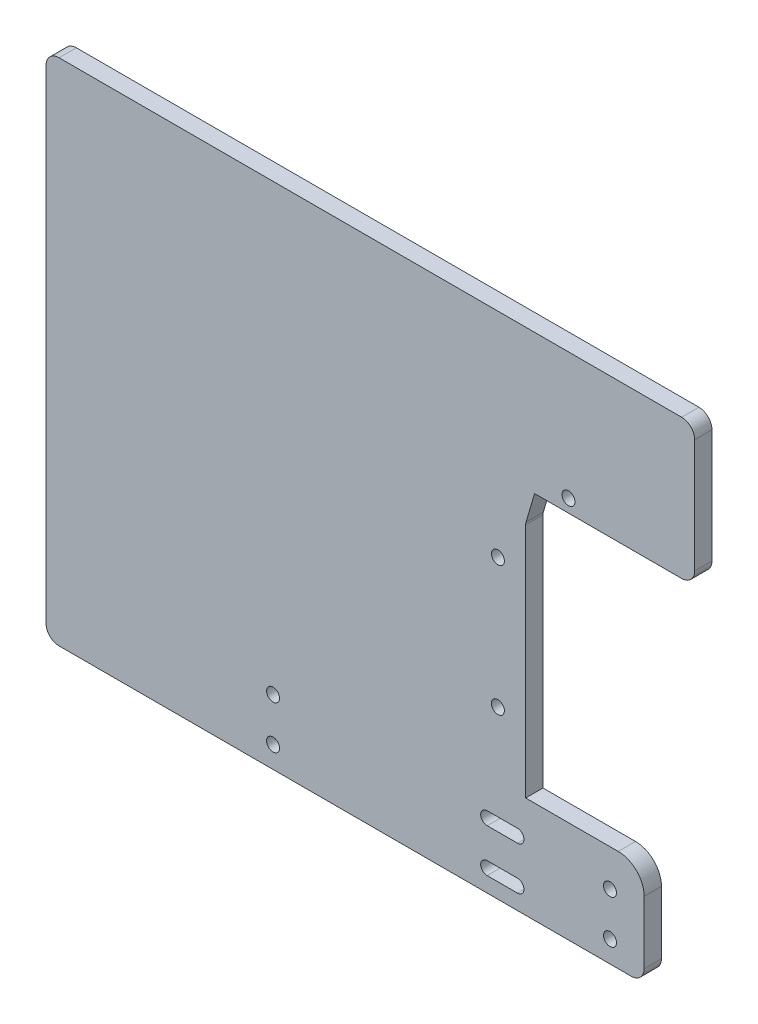
ISO-10303-21;
HEADER;
FILE_DESCRIPTION(('STEP AP214'),'2;1');
FILE_NAME('part.step','',(''),(''),'','','');
FILE_SCHEMA(('AUTOMOTIVE_DESIGN { 1 0 10303 214 1 1 1 1 }'));
ENDSEC;
DATA;
#1=APPLICATION_CONTEXT('core data for automotive mechanical design processes');
#2=APPLICATION_PROTOCOL_DEFINITION('international standard','automotive_design',2000,#1);
#3=PRODUCT_CONTEXT('',#1,'mechanical');
#4=PRODUCT('Part','Part','',(#3));
#5=PRODUCT_RELATED_PRODUCT_CATEGORY('part','',(#4));
#6=PRODUCT_DEFINITION_FORMATION('','',#4);
#7=PRODUCT_DEFINITION_CONTEXT('part definition',#1,'design');
#8=PRODUCT_DEFINITION('design','',#6,#7);
#9=PRODUCT_DEFINITION_SHAPE('','',#8);
#10=(LENGTH_UNIT() NAMED_UNIT(*) SI_UNIT(.MILLI.,.METRE.));
#11=(NAMED_UNIT(*) PLANE_ANGLE_UNIT() SI_UNIT($,.RADIAN.));
#12=(NAMED_UNIT(*) SI_UNIT($,.STERADIAN.) SOLID_ANGLE_UNIT());
#13=UNCERTAINTY_MEASURE_WITH_UNIT(LENGTH_MEASURE(1.E-05),#10,'distance_accuracy_value','');
#14=(GEOMETRIC_REPRESENTATION_CONTEXT(3) GLOBAL_UNCERTAINTY_ASSIGNED_CONTEXT((#13)) GLOBAL_UNIT_ASSIGNED_CONTEXT((#10,
#11,#12)) REPRESENTATION_CONTEXT('',''));
#15=CARTESIAN_POINT('',(0.,0.,0.));
#16=DIRECTION('',(0.,0.,1.));
#17=DIRECTION('',(1.,0.,0.));
#18=AXIS2_PLACEMENT_3D('',#15,#16,#17);
#19=CARTESIAN_POINT('',(25.6446855033038,139.732138716029,4.));
#20=DIRECTION('',(0.,0.,-1.));
#21=DIRECTION('',(-1.,0.,0.));
#22=AXIS2_PLACEMENT_3D('',#19,#20,#21);
#23=CYLINDRICAL_SURFACE('',#22,1.5);
#24=CARTESIAN_POINT('',(25.6446855033038,139.732138716029,0.));
#25=DIRECTION('',(0.,0.,1.));
#26=DIRECTION('',(1.,0.,0.));
#27=AXIS2_PLACEMENT_3D('',#24,#25,#26);
#28=CIRCLE('',#27,1.5);
#29=CARTESIAN_POINT('',(25.6446855033038,138.232138716029,0.));
#30=VERTEX_POINT('',#29);
#31=CARTESIAN_POINT('',(25.6446855033037,141.232138716029,0.));
#32=VERTEX_POINT('',#31);
#33=EDGE_CURVE('E408',#30,#32,#28,.T.);
#34=ORIENTED_EDGE('',*,*,#33,.F.);
#35=DIRECTION('',(0.,0.,-1.));
#36=VECTOR('',#35,1.);
#37=CARTESIAN_POINT('',(25.6446855033038,138.232138716029,4.));
#38=LINE('',#37,#36);
#39=CARTESIAN_POINT('',(25.6446855033038,138.232138716029,4.));
#40=VERTEX_POINT('',#39);
#41=EDGE_CURVE('E442',#40,#30,#38,.T.);
#42=ORIENTED_EDGE('',*,*,#41,.F.);
#43=CARTESIAN_POINT('',(25.6446855033038,139.732138716029,4.));
#44=DIRECTION('',(0.,0.,1.));
#45=DIRECTION('',(1.,0.,0.));
#46=AXIS2_PLACEMENT_3D('',#43,#44,#45);
#47=CIRCLE('',#46,1.5);
#48=CARTESIAN_POINT('',(25.6446855033037,141.232138716029,4.));
#49=VERTEX_POINT('',#48);
#50=EDGE_CURVE('E307',#40,#49,#47,.T.);
#51=ORIENTED_EDGE('',*,*,#50,.T.);
#52=DIRECTION('',(0.,0.,-1.));
#53=VECTOR('',#52,1.);
#54=CARTESIAN_POINT('',(25.6446855033037,141.232138716029,4.));
#55=LINE('',#54,#53);
#56=EDGE_CURVE('E432',#49,#32,#55,.T.);
#57=ORIENTED_EDGE('',*,*,#56,.T.);
#58=EDGE_LOOP('',(#34,#42,#51,#57));
#59=FACE_BOUND('',#58,.T.);
#60=ADVANCED_FACE('F47',(#59),#23,.F.);
#61=CARTESIAN_POINT('',(-5.48101796948979E-13,138.232138716029,4.));
#62=DIRECTION('',(0.,1.,0.));
#63=DIRECTION('',(-1.,0.,0.));
#64=AXIS2_PLACEMENT_3D('',#61,#62,#63);
#65=PLANE('',#64);
#66=DIRECTION('',(1.,0.,0.));
#67=VECTOR('',#66,1.);
#68=CARTESIAN_POINT('',(-5.48101796948979E-13,138.232138716029,0.));
#69=LINE('',#68,#67);
#70=CARTESIAN_POINT('',(18.6446855033037,138.232138716029,0.));
#71=VERTEX_POINT('',#70);
#72=EDGE_CURVE('E412',#71,#30,#69,.T.);
#73=ORIENTED_EDGE('',*,*,#72,.F.);
#74=DIRECTION('',(0.,0.,-1.));
#75=VECTOR('',#74,1.);
#76=CARTESIAN_POINT('',(18.6446855033037,138.232138716029,4.));
#77=LINE('',#76,#75);
#78=CARTESIAN_POINT('',(18.6446855033037,138.232138716029,4.));
#79=VERTEX_POINT('',#78);
#80=EDGE_CURVE('E439',#79,#71,#77,.T.);
#81=ORIENTED_EDGE('',*,*,#80,.F.);
#82=DIRECTION('',(1.,0.,0.));
#83=VECTOR('',#82,1.);
#84=CARTESIAN_POINT('',(-5.48101796948979E-13,138.232138716029,4.));
#85=LINE('',#84,#83);
#86=EDGE_CURVE('E311',#79,#40,#85,.T.);
#87=ORIENTED_EDGE('',*,*,#86,.T.);
#88=ORIENTED_EDGE('',*,*,#41,.T.);
#89=EDGE_LOOP('',(#73,#81,#87,#88));
#90=FACE_BOUND('',#89,.T.);
#91=ADVANCED_FACE('F584',(#90),#65,.T.);
#92=CARTESIAN_POINT('',(18.6446855033037,139.732138716029,4.));
#93=DIRECTION('',(0.,0.,-1.));
#94=DIRECTION('',(-1.,0.,0.));
#95=AXIS2_PLACEMENT_3D('',#92,#93,#94);
#96=CYLINDRICAL_SURFACE('',#95,1.50000000000002);
#97=CARTESIAN_POINT('',(18.6446855033037,139.732138716029,0.));
#98=DIRECTION('',(0.,0.,1.));
#99=DIRECTION('',(1.,0.,0.));
#100=AXIS2_PLACEMENT_3D('',#97,#98,#99);
#101=CIRCLE('',#100,1.50000000000002);
#102=CARTESIAN_POINT('',(18.6446855033037,141.232138716029,0.));
#103=VERTEX_POINT('',#102);
#104=EDGE_CURVE('E416',#103,#71,#101,.T.);
#105=ORIENTED_EDGE('',*,*,#104,.F.);
#106=DIRECTION('',(0.,0.,-1.));
#107=VECTOR('',#106,1.);
#108=CARTESIAN_POINT('',(18.6446855033037,141.232138716029,4.));
#109=LINE('',#108,#107);
#110=CARTESIAN_POINT('',(18.6446855033037,141.232138716029,4.));
#111=VERTEX_POINT('',#110);
#112=EDGE_CURVE('E435',#111,#103,#109,.T.);
#113=ORIENTED_EDGE('',*,*,#112,.F.);
#114=CARTESIAN_POINT('',(18.6446855033037,139.732138716029,4.));
#115=DIRECTION('',(0.,0.,1.));
#116=DIRECTION('',(1.,0.,0.));
#117=AXIS2_PLACEMENT_3D('',#114,#115,#116);
#118=CIRCLE('',#117,1.50000000000002);
#119=EDGE_CURVE('E315',#111,#79,#118,.T.);
#120=ORIENTED_EDGE('',*,*,#119,.T.);
#121=ORIENTED_EDGE('',*,*,#80,.T.);
#122=EDGE_LOOP('',(#105,#113,#120,#121));
#123=FACE_BOUND('',#122,.T.);
#124=ADVANCED_FACE('F590',(#123),#96,.F.);
#125=CARTESIAN_POINT('',(18.6446855033037,149.732138716029,4.));
#126=DIRECTION('',(0.,0.,-1.));
#127=DIRECTION('',(-1.,0.,0.));
#128=AXIS2_PLACEMENT_3D('',#125,#126,#127);
#129=CYLINDRICAL_SURFACE('',#128,1.5);
#130=CARTESIAN_POINT('',(18.6446855033037,149.732138716029,0.));
#131=DIRECTION('',(0.,0.,1.));
#132=DIRECTION('',(1.,0.,0.));
#133=AXIS2_PLACEMENT_3D('',#130,#131,#132);
#134=CIRCLE('',#133,1.5);
#135=CARTESIAN_POINT('',(18.6446855033037,151.232138716029,0.));
#136=VERTEX_POINT('',#135);
#137=CARTESIAN_POINT('',(18.6446855033037,148.232138716029,0.));
#138=VERTEX_POINT('',#137);
#139=EDGE_CURVE('E392',#136,#138,#134,.T.);
#140=ORIENTED_EDGE('',*,*,#139,.F.);
#141=DIRECTION('',(0.,0.,-1.));
#142=VECTOR('',#141,1.);
#143=CARTESIAN_POINT('',(18.6446855033037,151.232138716029,4.));
#144=LINE('',#143,#142);
#145=CARTESIAN_POINT('',(18.6446855033037,151.232138716029,4.));
#146=VERTEX_POINT('',#145);
#147=EDGE_CURVE('E436',#146,#136,#144,.T.);
#148=ORIENTED_EDGE('',*,*,#147,.F.);
#149=CARTESIAN_POINT('',(18.6446855033037,149.732138716029,4.));
#150=DIRECTION('',(0.,0.,1.));
#151=DIRECTION('',(1.,0.,0.));
#152=AXIS2_PLACEMENT_3D('',#149,#150,#151);
#153=CIRCLE('',#152,1.5);
#154=CARTESIAN_POINT('',(18.6446855033037,148.232138716029,4.));
#155=VERTEX_POINT('',#154);
#156=EDGE_CURVE('E291',#146,#155,#153,.T.);
#157=ORIENTED_EDGE('',*,*,#156,.T.);
#158=DIRECTION('',(0.,0.,-1.));
#159=VECTOR('',#158,1.);
#160=CARTESIAN_POINT('',(18.6446855033037,148.232138716029,4.));
#161=LINE('',#160,#159);
#162=EDGE_CURVE('E232',#155,#138,#161,.T.);
#163=ORIENTED_EDGE('',*,*,#162,.T.);
#164=EDGE_LOOP('',(#140,#148,#157,#163));
#165=FACE_BOUND('',#164,.T.);
#166=ADVANCED_FACE('F609',(#165),#129,.F.);
#167=CARTESIAN_POINT('',(0.,151.232138716029,4.));
#168=DIRECTION('',(0.,-1.,0.));
#169=DIRECTION('',(0.,0.,-1.));
#170=AXIS2_PLACEMENT_3D('',#167,#168,#169);
#171=PLANE('',#170);
#172=DIRECTION('',(-1.,0.,0.));
#173=VECTOR('',#172,1.);
#174=CARTESIAN_POINT('',(0.,151.232138716029,0.));
#175=LINE('',#174,#173);
#176=CARTESIAN_POINT('',(25.6446855033037,151.232138716029,0.));
#177=VERTEX_POINT('',#176);
#178=EDGE_CURVE('E396',#177,#136,#175,.T.);
#179=ORIENTED_EDGE('',*,*,#178,.F.);
#180=DIRECTION('',(0.,0.,-1.));
#181=VECTOR('',#180,1.);
#182=CARTESIAN_POINT('',(25.6446855033037,151.232138716029,4.));
#183=LINE('',#182,#181);
#184=CARTESIAN_POINT('',(25.6446855033037,151.232138716029,4.));
#185=VERTEX_POINT('',#184);
#186=EDGE_CURVE('E451',#185,#177,#183,.T.);
#187=ORIENTED_EDGE('',*,*,#186,.F.);
#188=DIRECTION('',(-1.,0.,0.));
#189=VECTOR('',#188,1.);
#190=CARTESIAN_POINT('',(0.,151.232138716029,4.));
#191=LINE('',#190,#189);
#192=EDGE_CURVE('E295',#185,#146,#191,.T.);
#193=ORIENTED_EDGE('',*,*,#192,.T.);
#194=ORIENTED_EDGE('',*,*,#147,.T.);
#195=EDGE_LOOP('',(#179,#187,#193,#194));
#196=FACE_BOUND('',#195,.T.);
#197=ADVANCED_FACE('F605',(#196),#171,.T.);
#198=CARTESIAN_POINT('',(25.6446855033037,149.732138716029,4.));
#199=DIRECTION('',(0.,0.,-1.));
#200=DIRECTION('',(-1.,0.,0.));
#201=AXIS2_PLACEMENT_3D('',#198,#199,#200);
#202=CYLINDRICAL_SURFACE('',#201,1.5);
#203=CARTESIAN_POINT('',(25.6446855033037,149.732138716029,0.));
#204=DIRECTION('',(0.,0.,1.));
#205=DIRECTION('',(1.,0.,0.));
#206=AXIS2_PLACEMENT_3D('',#203,#204,#205);
#207=CIRCLE('',#206,1.5);
#208=CARTESIAN_POINT('',(25.6446855033037,148.232138716029,0.));
#209=VERTEX_POINT('',#208);
#210=EDGE_CURVE('E400',#209,#177,#207,.T.);
#211=ORIENTED_EDGE('',*,*,#210,.F.);
#212=DIRECTION('',(0.,0.,-1.));
#213=VECTOR('',#212,1.);
#214=CARTESIAN_POINT('',(25.6446855033037,148.232138716029,4.));
#215=LINE('',#214,#213);
#216=CARTESIAN_POINT('',(25.6446855033037,148.232138716029,4.));
#217=VERTEX_POINT('',#216);
#218=EDGE_CURVE('E448',#217,#209,#215,.T.);
#219=ORIENTED_EDGE('',*,*,#218,.F.);
#220=CARTESIAN_POINT('',(25.6446855033037,149.732138716029,4.));
#221=DIRECTION('',(0.,0.,1.));
#222=DIRECTION('',(1.,0.,0.));
#223=AXIS2_PLACEMENT_3D('',#220,#221,#222);
#224=CIRCLE('',#223,1.5);
#225=EDGE_CURVE('E299',#217,#185,#224,.T.);
#226=ORIENTED_EDGE('',*,*,#225,.T.);
#227=ORIENTED_EDGE('',*,*,#186,.T.);
#228=EDGE_LOOP('',(#211,#219,#226,#227));
#229=FACE_BOUND('',#228,.T.);
#230=ADVANCED_FACE('F602',(#229),#202,.F.);
#231=CARTESIAN_POINT('',(0.,134.732138716025,4.));
#232=DIRECTION('',(0.,1.,0.));
#233=DIRECTION('',(-1.,0.,0.));
#234=AXIS2_PLACEMENT_3D('',#231,#232,#233);
#235=PLANE('',#234);
#236=DIRECTION('',(1.,0.,0.));
#237=VECTOR('',#236,1.);
#238=CARTESIAN_POINT('',(0.,134.732138716025,0.));
#239=LINE('',#238,#237);
#240=CARTESIAN_POINT('',(-80.3753144967017,134.732138716025,0.));
#241=VERTEX_POINT('',#240);
#242=CARTESIAN_POINT('',(51.9446855033038,134.732138716025,0.));
#243=VERTEX_POINT('',#242);
#244=EDGE_CURVE('E332',#241,#243,#239,.T.);
#245=ORIENTED_EDGE('',*,*,#244,.T.);
#246=DIRECTION('',(0.,0.,-1.));
#247=VECTOR('',#246,1.);
#248=CARTESIAN_POINT('',(51.9446855033038,134.732138716025,4.));
#249=LINE('',#248,#247);
#250=CARTESIAN_POINT('',(51.9446855033038,134.732138716025,4.));
#251=VERTEX_POINT('',#250);
#252=EDGE_CURVE('E520',#243,#251,#249,.F.);
#253=ORIENTED_EDGE('',*,*,#252,.T.);
#254=DIRECTION('',(1.,0.,0.));
#255=VECTOR('',#254,1.);
#256=CARTESIAN_POINT('',(0.,134.732138716025,4.));
#257=LINE('',#256,#255);
#258=CARTESIAN_POINT('',(-80.3753144967017,134.732138716025,4.));
#259=VERTEX_POINT('',#258);
#260=EDGE_CURVE('E222',#259,#251,#257,.T.);
#261=ORIENTED_EDGE('',*,*,#260,.F.);
#262=DIRECTION('',(0.,0.,-1.));
#263=VECTOR('',#262,1.);
#264=CARTESIAN_POINT('',(-80.3753144967017,134.732138716025,4.));
#265=LINE('',#264,#263);
#266=EDGE_CURVE('E516',#259,#241,#265,.T.);
#267=ORIENTED_EDGE('',*,*,#266,.T.);
#268=EDGE_LOOP('',(#245,#253,#261,#267));
#269=FACE_BOUND('',#268,.T.);
#270=ADVANCED_FACE('F539',(#269),#235,.F.);
#271=CARTESIAN_POINT('',(54.9446855033038,0.,4.));
#272=DIRECTION('',(-1.,0.,0.));
#273=DIRECTION('',(0.,0.,1.));
#274=AXIS2_PLACEMENT_3D('',#271,#272,#273);
#275=PLANE('',#274);
#276=DIRECTION('',(0.,1.,0.));
#277=VECTOR('',#276,1.);
#278=CARTESIAN_POINT('',(54.9446855033038,0.,4.));
#279=LINE('',#278,#277);
#280=CARTESIAN_POINT('',(54.9446855033038,137.732138716025,4.));
#281=VERTEX_POINT('',#280);
#282=CARTESIAN_POINT('',(54.9446855033038,152.232138716029,4.));
#283=VERTEX_POINT('',#282);
#284=EDGE_CURVE('E207',#281,#283,#279,.T.);
#285=ORIENTED_EDGE('',*,*,#284,.F.);
#286=DIRECTION('',(0.,0.,-1.));
#287=VECTOR('',#286,1.);
#288=CARTESIAN_POINT('',(54.9446855033038,137.732138716025,4.));
#289=LINE('',#288,#287);
#290=CARTESIAN_POINT('',(54.9446855033038,137.732138716025,0.));
#291=VERTEX_POINT('',#290);
#292=EDGE_CURVE('E513',#281,#291,#289,.T.);
#293=ORIENTED_EDGE('',*,*,#292,.T.);
#294=DIRECTION('',(0.,1.,0.));
#295=VECTOR('',#294,1.);
#296=CARTESIAN_POINT('',(54.9446855033038,0.,0.));
#297=LINE('',#296,#295);
#298=CARTESIAN_POINT('',(54.9446855033038,152.232138716029,0.));
#299=VERTEX_POINT('',#298);
#300=EDGE_CURVE('E228',#291,#299,#297,.T.);
#301=ORIENTED_EDGE('',*,*,#300,.T.);
#302=DIRECTION('',(0.,0.,-1.));
#303=VECTOR('',#302,1.);
#304=CARTESIAN_POINT('',(54.9446855033038,152.232138716029,4.));
#305=LINE('',#304,#303);
#306=EDGE_CURVE('E225',#283,#299,#305,.T.);
#307=ORIENTED_EDGE('',*,*,#306,.F.);
#308=EDGE_LOOP('',(#285,#293,#301,#307));
#309=FACE_BOUND('',#308,.T.);
#310=ADVANCED_FACE('F226',(#309),#275,.F.);
#311=CARTESIAN_POINT('',(48.9446855033037,152.232138716029,4.));
#312=DIRECTION('',(0.,0.,-1.));
#313=DIRECTION('',(-1.,0.,0.));
#314=AXIS2_PLACEMENT_3D('',#311,#312,#313);
#315=CYLINDRICAL_SURFACE('',#314,6.00000000000001);
#316=CARTESIAN_POINT('',(48.9446855033037,152.232138716029,0.));
#317=DIRECTION('',(0.,0.,1.));
#318=DIRECTION('',(1.,0.,0.));
#319=AXIS2_PLACEMENT_3D('',#316,#317,#318);
#320=CIRCLE('',#319,6.00000000000001);
#321=CARTESIAN_POINT('',(48.9446855033037,158.232138716029,0.));
#322=VERTEX_POINT('',#321);
#323=EDGE_CURVE('E338',#299,#322,#320,.T.);
#324=ORIENTED_EDGE('',*,*,#323,.T.);
#325=DIRECTION('',(0.,0.,-1.));
#326=VECTOR('',#325,1.);
#327=CARTESIAN_POINT('',(48.9446855033037,158.232138716029,4.));
#328=LINE('',#327,#326);
#329=CARTESIAN_POINT('',(48.9446855033037,158.232138716029,4.));
#330=VERTEX_POINT('',#329);
#331=EDGE_CURVE('E233',#330,#322,#328,.T.);
#332=ORIENTED_EDGE('',*,*,#331,.F.);
#333=CARTESIAN_POINT('',(48.9446855033037,152.232138716029,4.));
#334=DIRECTION('',(0.,0.,1.));
#335=DIRECTION('',(1.,0.,0.));
#336=AXIS2_PLACEMENT_3D('',#333,#334,#335);
#337=CIRCLE('',#336,6.00000000000001);
#338=EDGE_CURVE('E213',#283,#330,#337,.T.);
#339=ORIENTED_EDGE('',*,*,#338,.F.);
#340=ORIENTED_EDGE('',*,*,#306,.T.);
#341=EDGE_LOOP('',(#324,#332,#339,#340));
#342=FACE_BOUND('',#341,.T.);
#343=ADVANCED_FACE('F235',(#342),#315,.T.);
#344=CARTESIAN_POINT('',(0.,158.232138716029,4.));
#345=DIRECTION('',(0.,-1.,0.));
#346=DIRECTION('',(0.,0.,-1.));
#347=AXIS2_PLACEMENT_3D('',#344,#345,#346);
#348=PLANE('',#347);
#349=DIRECTION('',(-1.,0.,0.));
#350=VECTOR('',#349,1.);
#351=CARTESIAN_POINT('',(0.,158.232138716029,0.));
#352=LINE('',#351,#350);
#353=CARTESIAN_POINT('',(27.5446855033038,158.232138716029,0.));
#354=VERTEX_POINT('',#353);
#355=EDGE_CURVE('E341',#322,#354,#352,.T.);
#356=ORIENTED_EDGE('',*,*,#355,.T.);
#357=DIRECTION('',(0.,0.,-1.));
#358=VECTOR('',#357,1.);
#359=CARTESIAN_POINT('',(27.5446855033038,158.232138716029,4.));
#360=LINE('',#359,#358);
#361=CARTESIAN_POINT('',(27.5446855033038,158.232138716029,4.));
#362=VERTEX_POINT('',#361);
#363=EDGE_CURVE('E464',#362,#354,#360,.T.);
#364=ORIENTED_EDGE('',*,*,#363,.F.);
#365=DIRECTION('',(-1.,0.,0.));
#366=VECTOR('',#365,1.);
#367=CARTESIAN_POINT('',(0.,158.232138716029,4.));
#368=LINE('',#367,#366);
#369=EDGE_CURVE('E239',#330,#362,#368,.T.);
#370=ORIENTED_EDGE('',*,*,#369,.F.);
#371=ORIENTED_EDGE('',*,*,#331,.T.);
#372=EDGE_LOOP('',(#356,#364,#370,#371));
#373=FACE_BOUND('',#372,.T.);
#374=ADVANCED_FACE('F546',(#373),#348,.F.);
#375=CARTESIAN_POINT('',(27.5446855033039,0.,4.));
#376=DIRECTION('',(1.,0.,0.));
#377=DIRECTION('',(0.,1.,0.));
#378=AXIS2_PLACEMENT_3D('',#375,#376,#377);
#379=PLANE('',#378);
#380=DIRECTION('',(0.,-1.,0.));
#381=VECTOR('',#380,1.);
#382=CARTESIAN_POINT('',(27.5446855033039,0.,0.));
#383=LINE('',#382,#381);
#384=CARTESIAN_POINT('',(27.5446855033038,212.944120657372,0.));
#385=VERTEX_POINT('',#384);
#386=EDGE_CURVE('E345',#385,#354,#383,.T.);
#387=ORIENTED_EDGE('',*,*,#386,.F.);
#388=DIRECTION('',(0.,0.,-1.));
#389=VECTOR('',#388,1.);
#390=CARTESIAN_POINT('',(27.5446855033038,212.944120657372,4.));
#391=LINE('',#390,#389);
#392=CARTESIAN_POINT('',(27.5446855033038,212.944120657372,4.));
#393=VERTEX_POINT('',#392);
#394=EDGE_CURVE('E461',#393,#385,#391,.T.);
#395=ORIENTED_EDGE('',*,*,#394,.F.);
#396=DIRECTION('',(0.,-1.,0.));
#397=VECTOR('',#396,1.);
#398=CARTESIAN_POINT('',(27.5446855033039,0.,4.));
#399=LINE('',#398,#397);
#400=EDGE_CURVE('E242',#393,#362,#399,.T.);
#401=ORIENTED_EDGE('',*,*,#400,.T.);
#402=ORIENTED_EDGE('',*,*,#363,.T.);
#403=EDGE_LOOP('',(#387,#395,#401,#402));
#404=FACE_BOUND('',#403,.T.);
#405=ADVANCED_FACE('F648',(#404),#379,.T.);
#406=CARTESIAN_POINT('',(29.5446855033069,212.944120657372,4.));
#407=DIRECTION('',(0.,0.,-1.));
#408=DIRECTION('',(-1.,0.,0.));
#409=AXIS2_PLACEMENT_3D('',#406,#407,#408);
#410=CYLINDRICAL_SURFACE('',#409,2.00000000000303);
#411=CARTESIAN_POINT('',(29.5446855033069,212.944120657372,0.));
#412=DIRECTION('',(0.,0.,1.));
#413=DIRECTION('',(1.,0.,0.));
#414=AXIS2_PLACEMENT_3D('',#411,#412,#413);
#415=CIRCLE('',#414,2.00000000000303);
#416=CARTESIAN_POINT('',(27.6259545001614,213.508453305355,0.));
#417=VERTEX_POINT('',#416);
#418=EDGE_CURVE('E349',#417,#385,#415,.T.);
#419=ORIENTED_EDGE('',*,*,#418,.F.);
#420=DIRECTION('',(0.,0.,-1.));
#421=VECTOR('',#420,1.);
#422=CARTESIAN_POINT('',(27.6259545001614,213.508453305355,4.));
#423=LINE('',#422,#421);
#424=CARTESIAN_POINT('',(27.6259545001614,213.508453305355,4.));
#425=VERTEX_POINT('',#424);
#426=EDGE_CURVE('E458',#425,#417,#423,.T.);
#427=ORIENTED_EDGE('',*,*,#426,.F.);
#428=CARTESIAN_POINT('',(29.5446855033069,212.944120657372,4.));
#429=DIRECTION('',(0.,0.,1.));
#430=DIRECTION('',(1.,0.,0.));
#431=AXIS2_PLACEMENT_3D('',#428,#429,#430);
#432=CIRCLE('',#431,2.00000000000303);
#433=EDGE_CURVE('E249',#425,#393,#432,.T.);
#434=ORIENTED_EDGE('',*,*,#433,.T.);
#435=ORIENTED_EDGE('',*,*,#394,.T.);
#436=EDGE_LOOP('',(#419,#427,#434,#435));
#437=FACE_BOUND('',#436,.T.);
#438=ADVANCED_FACE('F554',(#437),#410,.F.);
#439=CARTESIAN_POINT('',(-32.3704384726988,9.52071719786343,4.));
#440=DIRECTION('',(0.959365501571184,-0.282166323991846,0.));
#441=DIRECTION('',(0.282166323991846,0.959365501571184,0.));
#442=AXIS2_PLACEMENT_3D('',#439,#440,#441);
#443=PLANE('',#442);
#444=DIRECTION('',(-0.282166323991846,-0.959365501571183,0.));
#445=VECTOR('',#444,1.);
#446=CARTESIAN_POINT('',(-32.3704384726988,9.52071719786343,0.));
#447=LINE('',#446,#445);
#448=CARTESIAN_POINT('',(29.6035090327146,220.232138716029,0.));
#449=VERTEX_POINT('',#448);
#450=EDGE_CURVE('E353',#449,#417,#447,.T.);
#451=ORIENTED_EDGE('',*,*,#450,.F.);
#452=DIRECTION('',(0.,0.,-1.));
#453=VECTOR('',#452,1.);
#454=CARTESIAN_POINT('',(29.6035090327146,220.232138716029,4.));
#455=LINE('',#454,#453);
#456=CARTESIAN_POINT('',(29.6035090327146,220.232138716029,4.));
#457=VERTEX_POINT('',#456);
#458=EDGE_CURVE('E331',#457,#449,#455,.T.);
#459=ORIENTED_EDGE('',*,*,#458,.F.);
#460=DIRECTION('',(-0.282166323991846,-0.959365501571183,0.));
#461=VECTOR('',#460,1.);
#462=CARTESIAN_POINT('',(-32.3704384726988,9.52071719786343,4.));
#463=LINE('',#462,#461);
#464=EDGE_CURVE('E253',#457,#425,#463,.T.);
#465=ORIENTED_EDGE('',*,*,#464,.T.);
#466=ORIENTED_EDGE('',*,*,#426,.T.);
#467=EDGE_LOOP('',(#451,#459,#465,#466));
#468=FACE_BOUND('',#467,.T.);
#469=ADVANCED_FACE('F558',(#468),#443,.T.);
#470=CARTESIAN_POINT('',(0.,220.232138716029,4.));
#471=DIRECTION('',(0.,1.,0.));
#472=DIRECTION('',(0.,0.,1.));
#473=AXIS2_PLACEMENT_3D('',#470,#471,#472);
#474=PLANE('',#473);
#475=DIRECTION('',(1.,0.,0.));
#476=VECTOR('',#475,1.);
#477=CARTESIAN_POINT('',(0.,220.232138716029,0.));
#478=LINE('',#477,#476);
#479=CARTESIAN_POINT('',(63.6246855032982,220.232138716029,0.));
#480=VERTEX_POINT('',#479);
#481=EDGE_CURVE('E357',#449,#480,#478,.T.);
#482=ORIENTED_EDGE('',*,*,#481,.T.);
#483=DIRECTION('',(0.,0.,-1.));
#484=VECTOR('',#483,1.);
#485=CARTESIAN_POINT('',(63.6246855032982,220.232138716029,4.));
#486=LINE('',#485,#484);
#487=CARTESIAN_POINT('',(63.6246855032982,220.232138716029,4.));
#488=VERTEX_POINT('',#487);
#489=EDGE_CURVE('E510',#480,#488,#486,.F.);
#490=ORIENTED_EDGE('',*,*,#489,.T.);
#491=DIRECTION('',(1.,0.,0.));
#492=VECTOR('',#491,1.);
#493=CARTESIAN_POINT('',(0.,220.232138716029,4.));
#494=LINE('',#493,#492);
#495=EDGE_CURVE('E257',#457,#488,#494,.T.);
#496=ORIENTED_EDGE('',*,*,#495,.F.);
#497=ORIENTED_EDGE('',*,*,#458,.T.);
#498=EDGE_LOOP('',(#482,#490,#496,#497));
#499=FACE_BOUND('',#498,.T.);
#500=ADVANCED_FACE('F641',(#499),#474,.F.);
#501=CARTESIAN_POINT('',(66.6246855032982,0.,4.));
#502=DIRECTION('',(1.,0.,0.));
#503=DIRECTION('',(0.,1.,0.));
#504=AXIS2_PLACEMENT_3D('',#501,#502,#503);
#505=PLANE('',#504);
#506=DIRECTION('',(0.,-1.,0.));
#507=VECTOR('',#506,1.);
#508=CARTESIAN_POINT('',(66.6246855032982,0.,0.));
#509=LINE('',#508,#507);
#510=CARTESIAN_POINT('',(66.6246855032982,249.532138716028,0.));
#511=VERTEX_POINT('',#510);
#512=CARTESIAN_POINT('',(66.6246855032982,223.232138716029,0.));
#513=VERTEX_POINT('',#512);
#514=EDGE_CURVE('E361',#511,#513,#509,.T.);
#515=ORIENTED_EDGE('',*,*,#514,.F.);
#516=DIRECTION('',(0.,0.,-1.));
#517=VECTOR('',#516,1.);
#518=CARTESIAN_POINT('',(66.6246855032982,249.532138716028,4.));
#519=LINE('',#518,#517);
#520=CARTESIAN_POINT('',(66.6246855032982,249.532138716028,4.));
#521=VERTEX_POINT('',#520);
#522=EDGE_CURVE('E494',#511,#521,#519,.F.);
#523=ORIENTED_EDGE('',*,*,#522,.T.);
#524=DIRECTION('',(0.,-1.,0.));
#525=VECTOR('',#524,1.);
#526=CARTESIAN_POINT('',(66.6246855032982,0.,4.));
#527=LINE('',#526,#525);
#528=CARTESIAN_POINT('',(66.6246855032982,223.232138716029,4.));
#529=VERTEX_POINT('',#528);
#530=EDGE_CURVE('E261',#521,#529,#527,.T.);
#531=ORIENTED_EDGE('',*,*,#530,.T.);
#532=DIRECTION('',(0.,0.,-1.));
#533=VECTOR('',#532,1.);
#534=CARTESIAN_POINT('',(66.6246855032982,223.232138716029,0.));
#535=LINE('',#534,#533);
#536=EDGE_CURVE('E490',#529,#513,#535,.T.);
#537=ORIENTED_EDGE('',*,*,#536,.T.);
#538=EDGE_LOOP('',(#515,#523,#531,#537));
#539=FACE_BOUND('',#538,.T.);
#540=ADVANCED_FACE('F568',(#539),#505,.T.);
#541=CARTESIAN_POINT('',(0.,252.532138716028,4.));
#542=DIRECTION('',(0.,-1.,0.));
#543=DIRECTION('',(0.,0.,-1.));
#544=AXIS2_PLACEMENT_3D('',#541,#542,#543);
#545=PLANE('',#544);
#546=DIRECTION('',(-1.,0.,0.));
#547=VECTOR('',#546,1.);
#548=CARTESIAN_POINT('',(0.,252.532138716028,4.));
#549=LINE('',#548,#547);
#550=CARTESIAN_POINT('',(63.6246855032982,252.532138716028,4.));
#551=VERTEX_POINT('',#550);
#552=CARTESIAN_POINT('',(-80.3753144967018,252.532138716028,4.));
#553=VERTEX_POINT('',#552);
#554=EDGE_CURVE('E265',#551,#553,#549,.T.);
#555=ORIENTED_EDGE('',*,*,#554,.F.);
#556=DIRECTION('',(0.,0.,-1.));
#557=VECTOR('',#556,1.);
#558=CARTESIAN_POINT('',(63.6246855032982,252.532138716028,0.));
#559=LINE('',#558,#557);
#560=CARTESIAN_POINT('',(63.6246855032982,252.532138716028,0.));
#561=VERTEX_POINT('',#560);
#562=EDGE_CURVE('E471',#551,#561,#559,.T.);
#563=ORIENTED_EDGE('',*,*,#562,.T.);
#564=DIRECTION('',(-1.,0.,0.));
#565=VECTOR('',#564,1.);
#566=CARTESIAN_POINT('',(0.,252.532138716028,0.));
#567=LINE('',#566,#565);
#568=CARTESIAN_POINT('',(-80.3753144967018,252.532138716028,0.));
#569=VERTEX_POINT('',#568);
#570=EDGE_CURVE('E365',#561,#569,#567,.T.);
#571=ORIENTED_EDGE('',*,*,#570,.T.);
#572=DIRECTION('',(0.,0.,-1.));
#573=VECTOR('',#572,1.);
#574=CARTESIAN_POINT('',(-80.3753144967018,252.532138716028,4.));
#575=LINE('',#574,#573);
#576=EDGE_CURVE('E445',#569,#553,#575,.F.);
#577=ORIENTED_EDGE('',*,*,#576,.T.);
#578=EDGE_LOOP('',(#555,#563,#571,#577));
#579=FACE_BOUND('',#578,.T.);
#580=ADVANCED_FACE('F577',(#579),#545,.F.);
#581=CARTESIAN_POINT('',(47.0446855033087,149.732138716025,4.));
#582=DIRECTION('',(0.,0.,-1.));
#583=DIRECTION('',(-1.,0.,0.));
#584=AXIS2_PLACEMENT_3D('',#581,#582,#583);
#585=CYLINDRICAL_SURFACE('',#584,1.5);
#586=CARTESIAN_POINT('',(47.0446855033087,149.732138716025,4.));
#587=DIRECTION('',(0.,0.,1.));
#588=DIRECTION('',(1.,0.,0.));
#589=AXIS2_PLACEMENT_3D('',#586,#587,#588);
#590=CIRCLE('',#589,1.5);
#591=CARTESIAN_POINT('',(48.5446855033087,149.732138716025,4.));
#592=VERTEX_POINT('',#591);
#593=EDGE_CURVE('E323',#592,#592,#590,.T.);
#594=ORIENTED_EDGE('',*,*,#593,.T.);
#595=EDGE_LOOP('',(#594));
#596=FACE_BOUND('',#595,.T.);
#597=CARTESIAN_POINT('',(47.0446855033087,149.732138716025,0.));
#598=DIRECTION('',(0.,0.,1.));
#599=DIRECTION('',(1.,0.,0.));
#600=AXIS2_PLACEMENT_3D('',#597,#598,#599);
#601=CIRCLE('',#600,1.5);
#602=CARTESIAN_POINT('',(48.5446855033087,149.732138716025,0.));
#603=VERTEX_POINT('',#602);
#604=EDGE_CURVE('E424',#603,#603,#601,.T.);
#605=ORIENTED_EDGE('',*,*,#604,.F.);
#606=EDGE_LOOP('',(#605));
#607=FACE_BOUND('',#606,.T.);
#608=ADVANCED_FACE('F638',(#596,#607),#585,.F.);
#609=CARTESIAN_POINT('',(0.,141.232138716029,4.));
#610=DIRECTION('',(0.,-1.,0.));
#611=DIRECTION('',(0.,0.,-1.));
#612=AXIS2_PLACEMENT_3D('',#609,#610,#611);
#613=PLANE('',#612);
#614=DIRECTION('',(-1.,0.,0.));
#615=VECTOR('',#614,1.);
#616=CARTESIAN_POINT('',(0.,141.232138716029,0.));
#617=LINE('',#616,#615);
#618=EDGE_CURVE('E420',#32,#103,#617,.T.);
#619=ORIENTED_EDGE('',*,*,#618,.F.);
#620=ORIENTED_EDGE('',*,*,#56,.F.);
#621=DIRECTION('',(-1.,0.,0.));
#622=VECTOR('',#621,1.);
#623=CARTESIAN_POINT('',(0.,141.232138716029,4.));
#624=LINE('',#623,#622);
#625=EDGE_CURVE('E319',#49,#111,#624,.T.);
#626=ORIENTED_EDGE('',*,*,#625,.T.);
#627=ORIENTED_EDGE('',*,*,#112,.T.);
#628=EDGE_LOOP('',(#619,#620,#626,#627));
#629=FACE_BOUND('',#628,.T.);
#630=ADVANCED_FACE('F600',(#629),#613,.T.);
#631=CARTESIAN_POINT('',(0.,148.232138716029,4.));
#632=DIRECTION('',(0.,1.,0.));
#633=DIRECTION('',(0.,0.,1.));
#634=AXIS2_PLACEMENT_3D('',#631,#632,#633);
#635=PLANE('',#634);
#636=DIRECTION('',(1.,0.,0.));
#637=VECTOR('',#636,1.);
#638=CARTESIAN_POINT('',(0.,148.232138716029,0.));
#639=LINE('',#638,#637);
#640=EDGE_CURVE('E404',#138,#209,#639,.T.);
#641=ORIENTED_EDGE('',*,*,#640,.F.);
#642=ORIENTED_EDGE('',*,*,#162,.F.);
#643=DIRECTION('',(1.,0.,0.));
#644=VECTOR('',#643,1.);
#645=CARTESIAN_POINT('',(0.,148.232138716029,4.));
#646=LINE('',#645,#644);
#647=EDGE_CURVE('E303',#155,#217,#646,.T.);
#648=ORIENTED_EDGE('',*,*,#647,.T.);
#649=ORIENTED_EDGE('',*,*,#218,.T.);
#650=EDGE_LOOP('',(#641,#642,#648,#649));
#651=FACE_BOUND('',#650,.T.);
#652=ADVANCED_FACE('F596',(#651),#635,.T.);
#653=CARTESIAN_POINT('',(37.4446855033056,223.232138716029,4.));
#654=DIRECTION('',(0.,0.,-1.));
#655=DIRECTION('',(-1.,0.,0.));
#656=AXIS2_PLACEMENT_3D('',#653,#654,#655);
#657=CYLINDRICAL_SURFACE('',#656,1.5);
#658=CARTESIAN_POINT('',(37.4446855033056,223.232138716029,4.));
#659=DIRECTION('',(0.,0.,1.));
#660=DIRECTION('',(1.,0.,0.));
#661=AXIS2_PLACEMENT_3D('',#658,#659,#660);
#662=CIRCLE('',#661,1.5);
#663=CARTESIAN_POINT('',(38.9446855033056,223.232138716029,4.));
#664=VERTEX_POINT('',#663);
#665=EDGE_CURVE('E287',#664,#664,#662,.T.);
#666=ORIENTED_EDGE('',*,*,#665,.T.);
#667=EDGE_LOOP('',(#666));
#668=FACE_BOUND('',#667,.T.);
#669=CARTESIAN_POINT('',(37.4446855033056,223.232138716029,0.));
#670=DIRECTION('',(0.,0.,1.));
#671=DIRECTION('',(1.,0.,0.));
#672=AXIS2_PLACEMENT_3D('',#669,#670,#671);
#673=CIRCLE('',#672,1.5);
#674=CARTESIAN_POINT('',(38.9446855033056,223.232138716029,0.));
#675=VERTEX_POINT('',#674);
#676=EDGE_CURVE('E388',#675,#675,#673,.T.);
#677=ORIENTED_EDGE('',*,*,#676,.F.);
#678=EDGE_LOOP('',(#677));
#679=FACE_BOUND('',#678,.T.);
#680=ADVANCED_FACE('F599',(#668,#679),#657,.F.);
#681=CARTESIAN_POINT('',(-30.8753144967018,139.732138716025,4.));
#682=DIRECTION('',(0.,0.,-1.));
#683=DIRECTION('',(-1.,0.,0.));
#684=AXIS2_PLACEMENT_3D('',#681,#682,#683);
#685=CYLINDRICAL_SURFACE('',#684,1.50000000000003);
#686=CARTESIAN_POINT('',(-30.8753144967018,139.732138716025,4.));
#687=DIRECTION('',(0.,0.,1.));
#688=DIRECTION('',(1.,0.,0.));
#689=AXIS2_PLACEMENT_3D('',#686,#687,#688);
#690=CIRCLE('',#689,1.50000000000003);
#691=CARTESIAN_POINT('',(-29.3753144967017,139.732138716025,4.));
#692=VERTEX_POINT('',#691);
#693=EDGE_CURVE('E283',#692,#692,#690,.T.);
#694=ORIENTED_EDGE('',*,*,#693,.T.);
#695=EDGE_LOOP('',(#694));
#696=FACE_BOUND('',#695,.T.);
#697=CARTESIAN_POINT('',(-30.8753144967018,139.732138716025,0.));
#698=DIRECTION('',(0.,0.,1.));
#699=DIRECTION('',(1.,0.,0.));
#700=AXIS2_PLACEMENT_3D('',#697,#698,#699);
#701=CIRCLE('',#700,1.50000000000003);
#702=CARTESIAN_POINT('',(-29.3753144967017,139.732138716025,0.));
#703=VERTEX_POINT('',#702);
#704=EDGE_CURVE('E384',#703,#703,#701,.T.);
#705=ORIENTED_EDGE('',*,*,#704,.F.);
#706=EDGE_LOOP('',(#705));
#707=FACE_BOUND('',#706,.T.);
#708=ADVANCED_FACE('F616',(#696,#707),#685,.F.);
#709=CARTESIAN_POINT('',(-30.8753144967018,149.732138716025,4.));
#710=DIRECTION('',(0.,0.,-1.));
#711=DIRECTION('',(-1.,0.,0.));
#712=AXIS2_PLACEMENT_3D('',#709,#710,#711);
#713=CYLINDRICAL_SURFACE('',#712,1.5);
#714=CARTESIAN_POINT('',(-30.8753144967018,149.732138716025,4.));
#715=DIRECTION('',(0.,0.,1.));
#716=DIRECTION('',(1.,0.,0.));
#717=AXIS2_PLACEMENT_3D('',#714,#715,#716);
#718=CIRCLE('',#717,1.5);
#719=CARTESIAN_POINT('',(-29.3753144967018,149.732138716025,4.));
#720=VERTEX_POINT('',#719);
#721=EDGE_CURVE('E279',#720,#720,#718,.T.);
#722=ORIENTED_EDGE('',*,*,#721,.T.);
#723=EDGE_LOOP('',(#722));
#724=FACE_BOUND('',#723,.T.);
#725=CARTESIAN_POINT('',(-30.8753144967018,149.732138716025,0.));
#726=DIRECTION('',(0.,0.,1.));
#727=DIRECTION('',(1.,0.,0.));
#728=AXIS2_PLACEMENT_3D('',#725,#726,#727);
#729=CIRCLE('',#728,1.5);
#730=CARTESIAN_POINT('',(-29.3753144967018,149.732138716025,0.));
#731=VERTEX_POINT('',#730);
#732=EDGE_CURVE('E380',#731,#731,#729,.T.);
#733=ORIENTED_EDGE('',*,*,#732,.F.);
#734=EDGE_LOOP('',(#733));
#735=FACE_BOUND('',#734,.T.);
#736=ADVANCED_FACE('F620',(#724,#735),#713,.F.);
#737=CARTESIAN_POINT('',(21.1246855032982,173.232138716029,4.));
#738=DIRECTION('',(0.,0.,-1.));
#739=DIRECTION('',(-1.,0.,0.));
#740=AXIS2_PLACEMENT_3D('',#737,#738,#739);
#741=CYLINDRICAL_SURFACE('',#740,1.5);
#742=CARTESIAN_POINT('',(21.1246855032982,173.232138716029,4.));
#743=DIRECTION('',(0.,0.,1.));
#744=DIRECTION('',(1.,0.,0.));
#745=AXIS2_PLACEMENT_3D('',#742,#743,#744);
#746=CIRCLE('',#745,1.5);
#747=CARTESIAN_POINT('',(22.6246855032982,173.232138716029,4.));
#748=VERTEX_POINT('',#747);
#749=EDGE_CURVE('E275',#748,#748,#746,.T.);
#750=ORIENTED_EDGE('',*,*,#749,.T.);
#751=EDGE_LOOP('',(#750));
#752=FACE_BOUND('',#751,.T.);
#753=CARTESIAN_POINT('',(21.1246855032982,173.232138716029,0.));
#754=DIRECTION('',(0.,0.,1.));
#755=DIRECTION('',(1.,0.,0.));
#756=AXIS2_PLACEMENT_3D('',#753,#754,#755);
#757=CIRCLE('',#756,1.5);
#758=CARTESIAN_POINT('',(22.6246855032982,173.232138716029,0.));
#759=VERTEX_POINT('',#758);
#760=EDGE_CURVE('E376',#759,#759,#757,.T.);
#761=ORIENTED_EDGE('',*,*,#760,.F.);
#762=EDGE_LOOP('',(#761));
#763=FACE_BOUND('',#762,.T.);
#764=ADVANCED_FACE('F624',(#752,#763),#741,.F.);
#765=CARTESIAN_POINT('',(21.1246855032982,203.232138716029,4.));
#766=DIRECTION('',(0.,0.,-1.));
#767=DIRECTION('',(-1.,0.,0.));
#768=AXIS2_PLACEMENT_3D('',#765,#766,#767);
#769=CYLINDRICAL_SURFACE('',#768,1.5);
#770=CARTESIAN_POINT('',(21.1246855032982,203.232138716029,4.));
#771=DIRECTION('',(0.,0.,1.));
#772=DIRECTION('',(1.,0.,0.));
#773=AXIS2_PLACEMENT_3D('',#770,#771,#772);
#774=CIRCLE('',#773,1.5);
#775=CARTESIAN_POINT('',(22.6246855032982,203.232138716029,4.));
#776=VERTEX_POINT('',#775);
#777=EDGE_CURVE('E271',#776,#776,#774,.T.);
#778=ORIENTED_EDGE('',*,*,#777,.T.);
#779=EDGE_LOOP('',(#778));
#780=FACE_BOUND('',#779,.T.);
#781=CARTESIAN_POINT('',(21.1246855032982,203.232138716029,0.));
#782=DIRECTION('',(0.,0.,1.));
#783=DIRECTION('',(1.,0.,0.));
#784=AXIS2_PLACEMENT_3D('',#781,#782,#783);
#785=CIRCLE('',#784,1.5);
#786=CARTESIAN_POINT('',(22.6246855032982,203.232138716029,0.));
#787=VERTEX_POINT('',#786);
#788=EDGE_CURVE('E372',#787,#787,#785,.T.);
#789=ORIENTED_EDGE('',*,*,#788,.F.);
#790=EDGE_LOOP('',(#789));
#791=FACE_BOUND('',#790,.T.);
#792=ADVANCED_FACE('F628',(#780,#791),#769,.F.);
#793=CARTESIAN_POINT('',(-83.3753144967017,0.,4.));
#794=DIRECTION('',(1.,0.,0.));
#795=DIRECTION('',(0.,1.,0.));
#796=AXIS2_PLACEMENT_3D('',#793,#794,#795);
#797=PLANE('',#796);
#798=DIRECTION('',(0.,-1.,0.));
#799=VECTOR('',#798,1.);
#800=CARTESIAN_POINT('',(-83.3753144967017,0.,0.));
#801=LINE('',#800,#799);
#802=CARTESIAN_POINT('',(-83.3753144967018,249.532138716028,0.));
#803=VERTEX_POINT('',#802);
#804=CARTESIAN_POINT('',(-83.3753144967018,137.732138716025,0.));
#805=VERTEX_POINT('',#804);
#806=EDGE_CURVE('E369',#803,#805,#801,.T.);
#807=ORIENTED_EDGE('',*,*,#806,.T.);
#808=DIRECTION('',(0.,0.,-1.));
#809=VECTOR('',#808,1.);
#810=CARTESIAN_POINT('',(-83.3753144967018,137.732138716025,4.));
#811=LINE('',#810,#809);
#812=CARTESIAN_POINT('',(-83.3753144967018,137.732138716025,4.));
#813=VERTEX_POINT('',#812);
#814=EDGE_CURVE('E11',#805,#813,#811,.F.);
#815=ORIENTED_EDGE('',*,*,#814,.T.);
#816=DIRECTION('',(0.,-1.,0.));
#817=VECTOR('',#816,1.);
#818=CARTESIAN_POINT('',(-83.3753144967017,0.,4.));
#819=LINE('',#818,#817);
#820=CARTESIAN_POINT('',(-83.3753144967018,249.532138716028,4.));
#821=VERTEX_POINT('',#820);
#822=EDGE_CURVE('E268',#821,#813,#819,.T.);
#823=ORIENTED_EDGE('',*,*,#822,.F.);
#824=DIRECTION('',(0.,0.,-1.));
#825=VECTOR('',#824,1.);
#826=CARTESIAN_POINT('',(-83.3753144967018,249.532138716028,4.));
#827=LINE('',#826,#825);
#828=EDGE_CURVE('E56',#821,#803,#827,.T.);
#829=ORIENTED_EDGE('',*,*,#828,.T.);
#830=EDGE_LOOP('',(#807,#815,#823,#829));
#831=FACE_BOUND('',#830,.T.);
#832=ADVANCED_FACE('F526',(#831),#797,.F.);
#833=CARTESIAN_POINT('',(47.0446855033087,139.732138716025,4.));
#834=DIRECTION('',(0.,0.,-1.));
#835=DIRECTION('',(-1.,0.,0.));
#836=AXIS2_PLACEMENT_3D('',#833,#834,#835);
#837=CYLINDRICAL_SURFACE('',#836,1.5);
#838=CARTESIAN_POINT('',(47.0446855033087,139.732138716025,4.));
#839=DIRECTION('',(0.,0.,1.));
#840=DIRECTION('',(1.,0.,0.));
#841=AXIS2_PLACEMENT_3D('',#838,#839,#840);
#842=CIRCLE('',#841,1.5);
#843=CARTESIAN_POINT('',(48.5446855033087,139.732138716025,4.));
#844=VERTEX_POINT('',#843);
#845=EDGE_CURVE('E327',#844,#844,#842,.T.);
#846=ORIENTED_EDGE('',*,*,#845,.T.);
#847=EDGE_LOOP('',(#846));
#848=FACE_BOUND('',#847,.T.);
#849=CARTESIAN_POINT('',(47.0446855033087,139.732138716025,0.));
#850=DIRECTION('',(0.,0.,1.));
#851=DIRECTION('',(1.,0.,0.));
#852=AXIS2_PLACEMENT_3D('',#849,#850,#851);
#853=CIRCLE('',#852,1.5);
#854=CARTESIAN_POINT('',(48.5446855033087,139.732138716025,0.));
#855=VERTEX_POINT('',#854);
#856=EDGE_CURVE('E428',#855,#855,#853,.T.);
#857=ORIENTED_EDGE('',*,*,#856,.F.);
#858=EDGE_LOOP('',(#857));
#859=FACE_BOUND('',#858,.T.);
#860=ADVANCED_FACE('F635',(#848,#859),#837,.F.);
#861=CARTESIAN_POINT('',(0.,0.,4.));
#862=DIRECTION('',(0.,0.,1.));
#863=DIRECTION('',(1.,0.,0.));
#864=AXIS2_PLACEMENT_3D('',#861,#862,#863);
#865=PLANE('',#864);
#866=ORIENTED_EDGE('',*,*,#530,.F.);
#867=CARTESIAN_POINT('',(63.6246855032982,249.532138716028,4.));
#868=DIRECTION('',(0.,0.,1.));
#869=DIRECTION('',(1.,0.,0.));
#870=AXIS2_PLACEMENT_3D('',#867,#868,#869);
#871=CIRCLE('',#870,3.);
#872=EDGE_CURVE('E507',#521,#551,#871,.T.);
#873=ORIENTED_EDGE('',*,*,#872,.T.);
#874=ORIENTED_EDGE('',*,*,#554,.T.);
#875=CARTESIAN_POINT('',(-80.3753144967018,249.532138716028,4.));
#876=DIRECTION('',(0.,0.,1.));
#877=DIRECTION('',(1.,0.,0.));
#878=AXIS2_PLACEMENT_3D('',#875,#876,#877);
#879=CIRCLE('',#878,3.);
#880=EDGE_CURVE('E68',#553,#821,#879,.T.);
#881=ORIENTED_EDGE('',*,*,#880,.T.);
#882=ORIENTED_EDGE('',*,*,#822,.T.);
#883=CARTESIAN_POINT('',(-80.3753144967017,137.732138716025,4.));
#884=DIRECTION('',(0.,0.,1.));
#885=DIRECTION('',(1.,0.,0.));
#886=AXIS2_PLACEMENT_3D('',#883,#884,#885);
#887=CIRCLE('',#886,3.);
#888=EDGE_CURVE('E499',#813,#259,#887,.T.);
#889=ORIENTED_EDGE('',*,*,#888,.T.);
#890=ORIENTED_EDGE('',*,*,#260,.T.);
#891=CARTESIAN_POINT('',(51.9446855033038,137.732138716025,4.));
#892=DIRECTION('',(0.,0.,1.));
#893=DIRECTION('',(1.,0.,0.));
#894=AXIS2_PLACEMENT_3D('',#891,#892,#893);
#895=CIRCLE('',#894,3.);
#896=EDGE_CURVE('E217',#251,#281,#895,.T.);
#897=ORIENTED_EDGE('',*,*,#896,.T.);
#898=ORIENTED_EDGE('',*,*,#284,.T.);
#899=ORIENTED_EDGE('',*,*,#338,.T.);
#900=ORIENTED_EDGE('',*,*,#369,.T.);
#901=ORIENTED_EDGE('',*,*,#400,.F.);
#902=ORIENTED_EDGE('',*,*,#433,.F.);
#903=ORIENTED_EDGE('',*,*,#464,.F.);
#904=ORIENTED_EDGE('',*,*,#495,.T.);
#905=CARTESIAN_POINT('',(63.6246855032982,223.232138716029,4.));
#906=DIRECTION('',(0.,0.,1.));
#907=DIRECTION('',(1.,0.,0.));
#908=AXIS2_PLACEMENT_3D('',#905,#906,#907);
#909=CIRCLE('',#908,3.);
#910=EDGE_CURVE('E504',#488,#529,#909,.T.);
#911=ORIENTED_EDGE('',*,*,#910,.T.);
#912=EDGE_LOOP('',(#866,#873,#874,#881,#882,#889,#890,#897,#898,#899,#900,#901,#902,#903,#904,#911));
#913=FACE_BOUND('',#912,.T.);
#914=ORIENTED_EDGE('',*,*,#777,.F.);
#915=EDGE_LOOP('',(#914));
#916=FACE_BOUND('',#915,.T.);
#917=ORIENTED_EDGE('',*,*,#749,.F.);
#918=EDGE_LOOP('',(#917));
#919=FACE_BOUND('',#918,.T.);
#920=ORIENTED_EDGE('',*,*,#721,.F.);
#921=EDGE_LOOP('',(#920));
#922=FACE_BOUND('',#921,.T.);
#923=ORIENTED_EDGE('',*,*,#693,.F.);
#924=EDGE_LOOP('',(#923));
#925=FACE_BOUND('',#924,.T.);
#926=ORIENTED_EDGE('',*,*,#665,.F.);
#927=EDGE_LOOP('',(#926));
#928=FACE_BOUND('',#927,.T.);
#929=ORIENTED_EDGE('',*,*,#156,.F.);
#930=ORIENTED_EDGE('',*,*,#192,.F.);
#931=ORIENTED_EDGE('',*,*,#225,.F.);
#932=ORIENTED_EDGE('',*,*,#647,.F.);
#933=EDGE_LOOP('',(#929,#930,#931,#932));
#934=FACE_BOUND('',#933,.T.);
#935=ORIENTED_EDGE('',*,*,#50,.F.);
#936=ORIENTED_EDGE('',*,*,#86,.F.);
#937=ORIENTED_EDGE('',*,*,#119,.F.);
#938=ORIENTED_EDGE('',*,*,#625,.F.);
#939=EDGE_LOOP('',(#935,#936,#937,#938));
#940=FACE_BOUND('',#939,.T.);
#941=ORIENTED_EDGE('',*,*,#593,.F.);
#942=EDGE_LOOP('',(#941));
#943=FACE_BOUND('',#942,.T.);
#944=ORIENTED_EDGE('',*,*,#845,.F.);
#945=EDGE_LOOP('',(#944));
#946=FACE_BOUND('',#945,.T.);
#947=ADVANCED_FACE('F210',(#913,#916,#919,#922,#925,#928,#934,#940,#943,#946),#865,.T.);
#948=CARTESIAN_POINT('',(0.,0.,0.));
#949=DIRECTION('',(0.,0.,1.));
#950=DIRECTION('',(1.,0.,0.));
#951=AXIS2_PLACEMENT_3D('',#948,#949,#950);
#952=PLANE('',#951);
#953=ORIENTED_EDGE('',*,*,#570,.F.);
#954=CARTESIAN_POINT('',(63.6246855032982,249.532138716028,0.));
#955=DIRECTION('',(0.,0.,1.));
#956=DIRECTION('',(1.,0.,0.));
#957=AXIS2_PLACEMENT_3D('',#954,#955,#956);
#958=CIRCLE('',#957,3.);
#959=EDGE_CURVE('E487',#561,#511,#958,.F.);
#960=ORIENTED_EDGE('',*,*,#959,.T.);
#961=ORIENTED_EDGE('',*,*,#514,.T.);
#962=CARTESIAN_POINT('',(63.6246855032982,223.232138716029,0.));
#963=DIRECTION('',(0.,0.,1.));
#964=DIRECTION('',(1.,0.,0.));
#965=AXIS2_PLACEMENT_3D('',#962,#963,#964);
#966=CIRCLE('',#965,3.);
#967=EDGE_CURVE('E484',#513,#480,#966,.F.);
#968=ORIENTED_EDGE('',*,*,#967,.T.);
#969=ORIENTED_EDGE('',*,*,#481,.F.);
#970=ORIENTED_EDGE('',*,*,#450,.T.);
#971=ORIENTED_EDGE('',*,*,#418,.T.);
#972=ORIENTED_EDGE('',*,*,#386,.T.);
#973=ORIENTED_EDGE('',*,*,#355,.F.);
#974=ORIENTED_EDGE('',*,*,#323,.F.);
#975=ORIENTED_EDGE('',*,*,#300,.F.);
#976=CARTESIAN_POINT('',(51.9446855033038,137.732138716025,0.));
#977=DIRECTION('',(0.,0.,1.));
#978=DIRECTION('',(1.,0.,0.));
#979=AXIS2_PLACEMENT_3D('',#976,#977,#978);
#980=CIRCLE('',#979,3.);
#981=EDGE_CURVE('E481',#291,#243,#980,.F.);
#982=ORIENTED_EDGE('',*,*,#981,.T.);
#983=ORIENTED_EDGE('',*,*,#244,.F.);
#984=CARTESIAN_POINT('',(-80.3753144967017,137.732138716025,0.));
#985=DIRECTION('',(0.,0.,1.));
#986=DIRECTION('',(1.,0.,0.));
#987=AXIS2_PLACEMENT_3D('',#984,#985,#986);
#988=CIRCLE('',#987,3.);
#989=EDGE_CURVE('E478',#241,#805,#988,.F.);
#990=ORIENTED_EDGE('',*,*,#989,.T.);
#991=ORIENTED_EDGE('',*,*,#806,.F.);
#992=CARTESIAN_POINT('',(-80.3753144967018,249.532138716028,0.));
#993=DIRECTION('',(0.,0.,1.));
#994=DIRECTION('',(1.,0.,0.));
#995=AXIS2_PLACEMENT_3D('',#992,#993,#994);
#996=CIRCLE('',#995,3.);
#997=EDGE_CURVE('E475',#803,#569,#996,.F.);
#998=ORIENTED_EDGE('',*,*,#997,.T.);
#999=EDGE_LOOP('',(#953,#960,#961,#968,#969,#970,#971,#972,#973,#974,#975,#982,#983,#990,#991,#998));
#1000=FACE_BOUND('',#999,.T.);
#1001=ORIENTED_EDGE('',*,*,#788,.T.);
#1002=EDGE_LOOP('',(#1001));
#1003=FACE_BOUND('',#1002,.T.);
#1004=ORIENTED_EDGE('',*,*,#760,.T.);
#1005=EDGE_LOOP('',(#1004));
#1006=FACE_BOUND('',#1005,.T.);
#1007=ORIENTED_EDGE('',*,*,#732,.T.);
#1008=EDGE_LOOP('',(#1007));
#1009=FACE_BOUND('',#1008,.T.);
#1010=ORIENTED_EDGE('',*,*,#704,.T.);
#1011=EDGE_LOOP('',(#1010));
#1012=FACE_BOUND('',#1011,.T.);
#1013=ORIENTED_EDGE('',*,*,#676,.T.);
#1014=EDGE_LOOP('',(#1013));
#1015=FACE_BOUND('',#1014,.T.);
#1016=ORIENTED_EDGE('',*,*,#139,.T.);
#1017=ORIENTED_EDGE('',*,*,#640,.T.);
#1018=ORIENTED_EDGE('',*,*,#210,.T.);
#1019=ORIENTED_EDGE('',*,*,#178,.T.);
#1020=EDGE_LOOP('',(#1016,#1017,#1018,#1019));
#1021=FACE_BOUND('',#1020,.T.);
#1022=ORIENTED_EDGE('',*,*,#33,.T.);
#1023=ORIENTED_EDGE('',*,*,#618,.T.);
#1024=ORIENTED_EDGE('',*,*,#104,.T.);
#1025=ORIENTED_EDGE('',*,*,#72,.T.);
#1026=EDGE_LOOP('',(#1022,#1023,#1024,#1025));
#1027=FACE_BOUND('',#1026,.T.);
#1028=ORIENTED_EDGE('',*,*,#604,.T.);
#1029=EDGE_LOOP('',(#1028));
#1030=FACE_BOUND('',#1029,.T.);
#1031=ORIENTED_EDGE('',*,*,#856,.T.);
#1032=EDGE_LOOP('',(#1031));
#1033=FACE_BOUND('',#1032,.T.);
#1034=ADVANCED_FACE('F530',(#1000,#1003,#1006,#1009,#1012,#1015,#1021,#1027,#1030,#1033),#952,.F.);
#1035=CARTESIAN_POINT('',(63.6246855032982,249.532138716028,4.));
#1036=DIRECTION('',(0.,0.,1.));
#1037=DIRECTION('',(1.,0.,0.));
#1038=AXIS2_PLACEMENT_3D('',#1035,#1036,#1037);
#1039=CYLINDRICAL_SURFACE('',#1038,3.);
#1040=ORIENTED_EDGE('',*,*,#872,.F.);
#1041=ORIENTED_EDGE('',*,*,#522,.F.);
#1042=ORIENTED_EDGE('',*,*,#959,.F.);
#1043=ORIENTED_EDGE('',*,*,#562,.F.);
#1044=EDGE_LOOP('',(#1040,#1041,#1042,#1043));
#1045=FACE_BOUND('',#1044,.T.);
#1046=ADVANCED_FACE('F574',(#1045),#1039,.T.);
#1047=CARTESIAN_POINT('',(63.6246855032982,223.232138716029,4.));
#1048=DIRECTION('',(0.,0.,1.));
#1049=DIRECTION('',(1.,0.,0.));
#1050=AXIS2_PLACEMENT_3D('',#1047,#1048,#1049);
#1051=CYLINDRICAL_SURFACE('',#1050,3.);
#1052=ORIENTED_EDGE('',*,*,#910,.F.);
#1053=ORIENTED_EDGE('',*,*,#489,.F.);
#1054=ORIENTED_EDGE('',*,*,#967,.F.);
#1055=ORIENTED_EDGE('',*,*,#536,.F.);
#1056=EDGE_LOOP('',(#1052,#1053,#1054,#1055));
#1057=FACE_BOUND('',#1056,.T.);
#1058=ADVANCED_FACE('F565',(#1057),#1051,.T.);
#1059=CARTESIAN_POINT('',(51.9446855033038,137.732138716025,4.));
#1060=DIRECTION('',(0.,0.,-1.));
#1061=DIRECTION('',(-1.,0.,0.));
#1062=AXIS2_PLACEMENT_3D('',#1059,#1060,#1061);
#1063=CYLINDRICAL_SURFACE('',#1062,3.);
#1064=ORIENTED_EDGE('',*,*,#896,.F.);
#1065=ORIENTED_EDGE('',*,*,#252,.F.);
#1066=ORIENTED_EDGE('',*,*,#981,.F.);
#1067=ORIENTED_EDGE('',*,*,#292,.F.);
#1068=EDGE_LOOP('',(#1064,#1065,#1066,#1067));
#1069=FACE_BOUND('',#1068,.T.);
#1070=ADVANCED_FACE('F543',(#1069),#1063,.T.);
#1071=CARTESIAN_POINT('',(-80.3753144967017,137.732138716025,4.));
#1072=DIRECTION('',(0.,0.,-1.));
#1073=DIRECTION('',(-1.,0.,0.));
#1074=AXIS2_PLACEMENT_3D('',#1071,#1072,#1073);
#1075=CYLINDRICAL_SURFACE('',#1074,3.);
#1076=ORIENTED_EDGE('',*,*,#888,.F.);
#1077=ORIENTED_EDGE('',*,*,#814,.F.);
#1078=ORIENTED_EDGE('',*,*,#989,.F.);
#1079=ORIENTED_EDGE('',*,*,#266,.F.);
#1080=EDGE_LOOP('',(#1076,#1077,#1078,#1079));
#1081=FACE_BOUND('',#1080,.T.);
#1082=ADVANCED_FACE('F536',(#1081),#1075,.T.);
#1083=CARTESIAN_POINT('',(-80.3753144967018,249.532138716028,4.));
#1084=DIRECTION('',(0.,0.,-1.));
#1085=DIRECTION('',(-1.,0.,0.));
#1086=AXIS2_PLACEMENT_3D('',#1083,#1084,#1085);
#1087=CYLINDRICAL_SURFACE('',#1086,3.);
#1088=ORIENTED_EDGE('',*,*,#880,.F.);
#1089=ORIENTED_EDGE('',*,*,#576,.F.);
#1090=ORIENTED_EDGE('',*,*,#997,.F.);
#1091=ORIENTED_EDGE('',*,*,#828,.F.);
#1092=EDGE_LOOP('',(#1088,#1089,#1090,#1091));
#1093=FACE_BOUND('',#1092,.T.);
#1094=ADVANCED_FACE('F49',(#1093),#1087,.T.);
#1095=CLOSED_SHELL('',(#60,#91,#124,#166,#197,#230,#270,#310,#343,#374,#405,#438,#469,#500,#540,
#580,#608,#630,#652,#680,#708,#736,#764,#792,#832,#860,#947,#1034,#1046,#1058,#1070,#1082,#1094));
#1096=MANIFOLD_SOLID_BREP('B2',#1095);
#1097=ADVANCED_BREP_SHAPE_REPRESENTATION('',(#18,#1096),#14);
#1098=SHAPE_DEFINITION_REPRESENTATION(#9,#1097);
ENDSEC;
END-ISO-10303-21;
